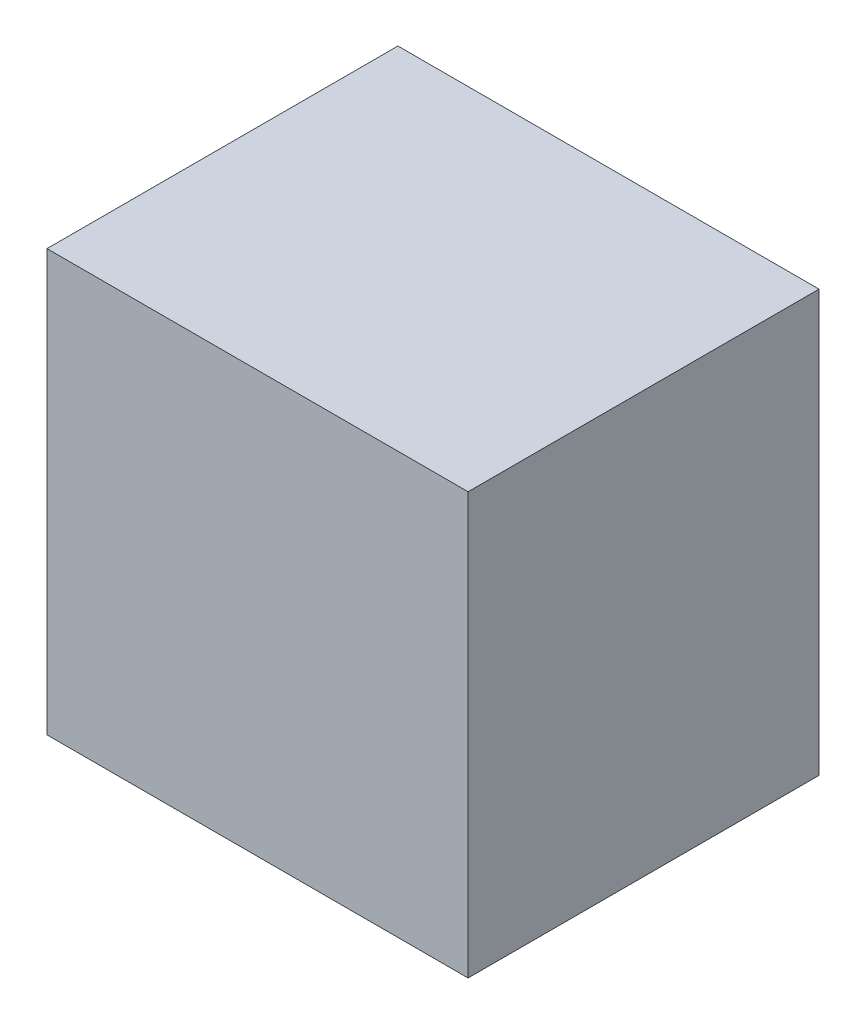
ISO-10303-21;
HEADER;
FILE_DESCRIPTION(('STEP AP214'),'2;1');
FILE_NAME('part.step','',(''),(''),'','','');
FILE_SCHEMA(('AUTOMOTIVE_DESIGN { 1 0 10303 214 1 1 1 1 }'));
ENDSEC;
DATA;
#1=APPLICATION_CONTEXT('core data for automotive mechanical design processes');
#2=APPLICATION_PROTOCOL_DEFINITION('international standard','automotive_design',2000,#1);
#3=PRODUCT_CONTEXT('',#1,'mechanical');
#4=PRODUCT('Part','Part','',(#3));
#5=PRODUCT_RELATED_PRODUCT_CATEGORY('part','',(#4));
#6=PRODUCT_DEFINITION_FORMATION('','',#4);
#7=PRODUCT_DEFINITION_CONTEXT('part definition',#1,'design');
#8=PRODUCT_DEFINITION('design','',#6,#7);
#9=PRODUCT_DEFINITION_SHAPE('','',#8);
#10=(LENGTH_UNIT() NAMED_UNIT(*) SI_UNIT(.MILLI.,.METRE.));
#11=(NAMED_UNIT(*) PLANE_ANGLE_UNIT() SI_UNIT($,.RADIAN.));
#12=(NAMED_UNIT(*) SI_UNIT($,.STERADIAN.) SOLID_ANGLE_UNIT());
#13=UNCERTAINTY_MEASURE_WITH_UNIT(LENGTH_MEASURE(1.E-05),#10,'distance_accuracy_value','');
#14=(GEOMETRIC_REPRESENTATION_CONTEXT(3) GLOBAL_UNCERTAINTY_ASSIGNED_CONTEXT((#13)) GLOBAL_UNIT_ASSIGNED_CONTEXT((#10,
#11,#12)) REPRESENTATION_CONTEXT('',''));
#15=CARTESIAN_POINT('',(0.,0.,0.));
#16=DIRECTION('',(0.,0.,1.));
#17=DIRECTION('',(1.,0.,0.));
#18=AXIS2_PLACEMENT_3D('',#15,#16,#17);
#19=CARTESIAN_POINT('',(0.,0.,30.));
#20=DIRECTION('',(1.,0.,0.));
#21=DIRECTION('',(0.,0.,-1.));
#22=AXIS2_PLACEMENT_3D('',#19,#20,#21);
#23=PLANE('',#22);
#24=DIRECTION('',(0.,-1.,0.));
#25=VECTOR('',#24,1.);
#26=CARTESIAN_POINT('',(0.,0.,0.));
#27=LINE('',#26,#25);
#28=CARTESIAN_POINT('',(0.,36.,0.));
#29=VERTEX_POINT('',#28);
#30=CARTESIAN_POINT('',(0.,0.,0.));
#31=VERTEX_POINT('',#30);
#32=EDGE_CURVE('E103',#29,#31,#27,.T.);
#33=ORIENTED_EDGE('',*,*,#32,.T.);
#34=DIRECTION('',(0.,0.,-1.));
#35=VECTOR('',#34,1.);
#36=CARTESIAN_POINT('',(0.,0.,30.));
#37=LINE('',#36,#35);
#38=CARTESIAN_POINT('',(0.,0.,30.));
#39=VERTEX_POINT('',#38);
#40=EDGE_CURVE('E11',#39,#31,#37,.T.);
#41=ORIENTED_EDGE('',*,*,#40,.F.);
#42=DIRECTION('',(0.,-1.,0.));
#43=VECTOR('',#42,1.);
#44=CARTESIAN_POINT('',(0.,0.,30.));
#45=LINE('',#44,#43);
#46=CARTESIAN_POINT('',(0.,36.,30.));
#47=VERTEX_POINT('',#46);
#48=EDGE_CURVE('E91',#47,#39,#45,.T.);
#49=ORIENTED_EDGE('',*,*,#48,.F.);
#50=DIRECTION('',(0.,0.,-1.));
#51=VECTOR('',#50,1.);
#52=CARTESIAN_POINT('',(0.,36.,30.));
#53=LINE('',#52,#51);
#54=EDGE_CURVE('E99',#47,#29,#53,.T.);
#55=ORIENTED_EDGE('',*,*,#54,.T.);
#56=EDGE_LOOP('',(#33,#41,#49,#55));
#57=FACE_BOUND('',#56,.T.);
#58=ADVANCED_FACE('F40',(#57),#23,.F.);
#59=CARTESIAN_POINT('',(0.,0.,30.));
#60=DIRECTION('',(0.,1.,0.));
#61=DIRECTION('',(0.,0.,1.));
#62=AXIS2_PLACEMENT_3D('',#59,#60,#61);
#63=PLANE('',#62);
#64=DIRECTION('',(1.,0.,0.));
#65=VECTOR('',#64,1.);
#66=CARTESIAN_POINT('',(0.,0.,0.));
#67=LINE('',#66,#65);
#68=CARTESIAN_POINT('',(36.,0.,0.));
#69=VERTEX_POINT('',#68);
#70=EDGE_CURVE('E95',#31,#69,#67,.T.);
#71=ORIENTED_EDGE('',*,*,#70,.T.);
#72=DIRECTION('',(0.,0.,-1.));
#73=VECTOR('',#72,1.);
#74=CARTESIAN_POINT('',(36.,0.,30.));
#75=LINE('',#74,#73);
#76=CARTESIAN_POINT('',(36.,0.,30.));
#77=VERTEX_POINT('',#76);
#78=EDGE_CURVE('E48',#77,#69,#75,.T.);
#79=ORIENTED_EDGE('',*,*,#78,.F.);
#80=DIRECTION('',(1.,0.,0.));
#81=VECTOR('',#80,1.);
#82=CARTESIAN_POINT('',(0.,0.,30.));
#83=LINE('',#82,#81);
#84=EDGE_CURVE('E86',#39,#77,#83,.T.);
#85=ORIENTED_EDGE('',*,*,#84,.F.);
#86=ORIENTED_EDGE('',*,*,#40,.T.);
#87=EDGE_LOOP('',(#71,#79,#85,#86));
#88=FACE_BOUND('',#87,.T.);
#89=ADVANCED_FACE('F94',(#88),#63,.F.);
#90=CARTESIAN_POINT('',(36.,0.,30.));
#91=DIRECTION('',(-1.,0.,0.));
#92=DIRECTION('',(0.,0.,1.));
#93=AXIS2_PLACEMENT_3D('',#90,#91,#92);
#94=PLANE('',#93);
#95=DIRECTION('',(0.,1.,0.));
#96=VECTOR('',#95,1.);
#97=CARTESIAN_POINT('',(36.,0.,0.));
#98=LINE('',#97,#96);
#99=CARTESIAN_POINT('',(36.,36.,0.));
#100=VERTEX_POINT('',#99);
#101=EDGE_CURVE('E73',#69,#100,#98,.T.);
#102=ORIENTED_EDGE('',*,*,#101,.T.);
#103=DIRECTION('',(0.,0.,-1.));
#104=VECTOR('',#103,1.);
#105=CARTESIAN_POINT('',(36.,36.,30.));
#106=LINE('',#105,#104);
#107=CARTESIAN_POINT('',(36.,36.,30.));
#108=VERTEX_POINT('',#107);
#109=EDGE_CURVE('E96',#108,#100,#106,.T.);
#110=ORIENTED_EDGE('',*,*,#109,.F.);
#111=DIRECTION('',(0.,1.,0.));
#112=VECTOR('',#111,1.);
#113=CARTESIAN_POINT('',(36.,0.,30.));
#114=LINE('',#113,#112);
#115=EDGE_CURVE('E89',#77,#108,#114,.T.);
#116=ORIENTED_EDGE('',*,*,#115,.F.);
#117=ORIENTED_EDGE('',*,*,#78,.T.);
#118=EDGE_LOOP('',(#102,#110,#116,#117));
#119=FACE_BOUND('',#118,.T.);
#120=ADVANCED_FACE('F97',(#119),#94,.F.);
#121=CARTESIAN_POINT('',(0.,36.,30.));
#122=DIRECTION('',(0.,-1.,0.));
#123=DIRECTION('',(0.,0.,-1.));
#124=AXIS2_PLACEMENT_3D('',#121,#122,#123);
#125=PLANE('',#124);
#126=DIRECTION('',(-1.,0.,0.));
#127=VECTOR('',#126,1.);
#128=CARTESIAN_POINT('',(0.,36.,0.));
#129=LINE('',#128,#127);
#130=EDGE_CURVE('E79',#100,#29,#129,.T.);
#131=ORIENTED_EDGE('',*,*,#130,.T.);
#132=ORIENTED_EDGE('',*,*,#54,.F.);
#133=DIRECTION('',(-1.,0.,0.));
#134=VECTOR('',#133,1.);
#135=CARTESIAN_POINT('',(0.,36.,30.));
#136=LINE('',#135,#134);
#137=EDGE_CURVE('E56',#108,#47,#136,.T.);
#138=ORIENTED_EDGE('',*,*,#137,.F.);
#139=ORIENTED_EDGE('',*,*,#109,.T.);
#140=EDGE_LOOP('',(#131,#132,#138,#139));
#141=FACE_BOUND('',#140,.T.);
#142=ADVANCED_FACE('F110',(#141),#125,.F.);
#143=CARTESIAN_POINT('',(0.,0.,30.));
#144=DIRECTION('',(0.,0.,-1.));
#145=DIRECTION('',(-1.,0.,0.));
#146=AXIS2_PLACEMENT_3D('',#143,#144,#145);
#147=PLANE('',#146);
#148=ORIENTED_EDGE('',*,*,#48,.T.);
#149=ORIENTED_EDGE('',*,*,#84,.T.);
#150=ORIENTED_EDGE('',*,*,#115,.T.);
#151=ORIENTED_EDGE('',*,*,#137,.T.);
#152=EDGE_LOOP('',(#148,#149,#150,#151));
#153=FACE_BOUND('',#152,.T.);
#154=ADVANCED_FACE('F87',(#153),#147,.F.);
#155=CARTESIAN_POINT('',(0.,0.,0.));
#156=DIRECTION('',(0.,0.,-1.));
#157=DIRECTION('',(-1.,0.,0.));
#158=AXIS2_PLACEMENT_3D('',#155,#156,#157);
#159=PLANE('',#158);
#160=ORIENTED_EDGE('',*,*,#32,.F.);
#161=ORIENTED_EDGE('',*,*,#130,.F.);
#162=ORIENTED_EDGE('',*,*,#101,.F.);
#163=ORIENTED_EDGE('',*,*,#70,.F.);
#164=EDGE_LOOP('',(#160,#161,#162,#163));
#165=FACE_BOUND('',#164,.T.);
#166=ADVANCED_FACE('F113',(#165),#159,.T.);
#167=CLOSED_SHELL('',(#58,#89,#120,#142,#154,#166));
#168=MANIFOLD_SOLID_BREP('B2',#167);
#169=ADVANCED_BREP_SHAPE_REPRESENTATION('',(#18,#168),#14);
#170=SHAPE_DEFINITION_REPRESENTATION(#9,#169);
ENDSEC;
END-ISO-10303-21;
